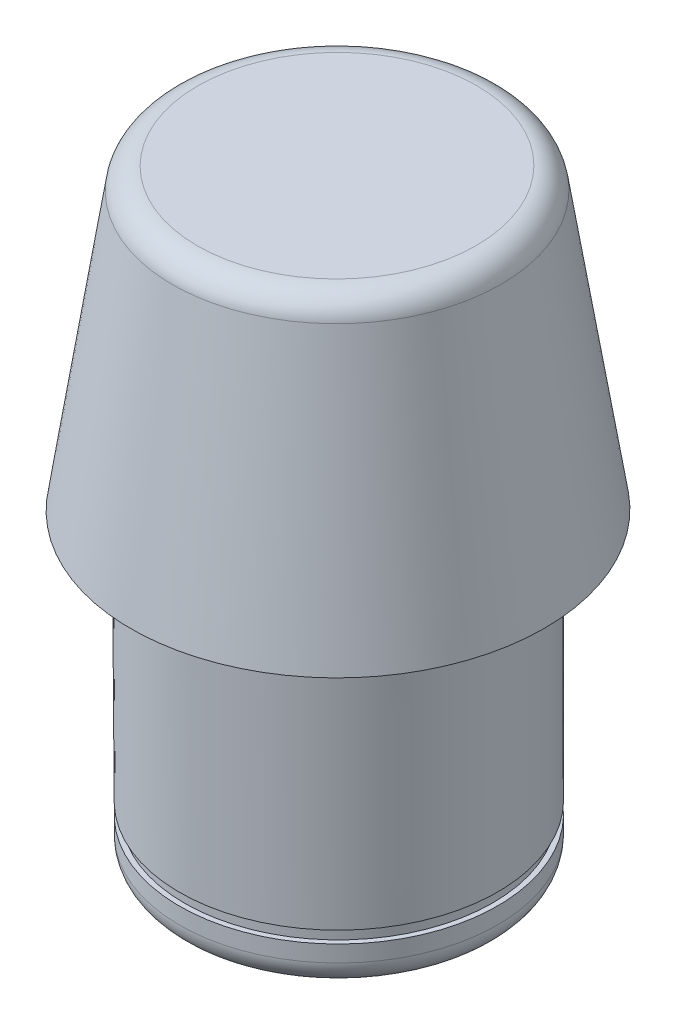
ISO-10303-21;
HEADER;
FILE_DESCRIPTION(('STEP AP214'),'2;1');
FILE_NAME('part.step','',(''),(''),'','','');
FILE_SCHEMA(('AUTOMOTIVE_DESIGN { 1 0 10303 214 1 1 1 1 }'));
ENDSEC;
DATA;
#1=APPLICATION_CONTEXT('core data for automotive mechanical design processes');
#2=APPLICATION_PROTOCOL_DEFINITION('international standard','automotive_design',2000,#1);
#3=PRODUCT_CONTEXT('',#1,'mechanical');
#4=PRODUCT('Part','Part','',(#3));
#5=PRODUCT_RELATED_PRODUCT_CATEGORY('part','',(#4));
#6=PRODUCT_DEFINITION_FORMATION('','',#4);
#7=PRODUCT_DEFINITION_CONTEXT('part definition',#1,'design');
#8=PRODUCT_DEFINITION('design','',#6,#7);
#9=PRODUCT_DEFINITION_SHAPE('','',#8);
#10=(LENGTH_UNIT() NAMED_UNIT(*) SI_UNIT(.MILLI.,.METRE.));
#11=(NAMED_UNIT(*) PLANE_ANGLE_UNIT() SI_UNIT($,.RADIAN.));
#12=(NAMED_UNIT(*) SI_UNIT($,.STERADIAN.) SOLID_ANGLE_UNIT());
#13=UNCERTAINTY_MEASURE_WITH_UNIT(LENGTH_MEASURE(1.E-05),#10,'distance_accuracy_value','');
#14=(GEOMETRIC_REPRESENTATION_CONTEXT(3) GLOBAL_UNCERTAINTY_ASSIGNED_CONTEXT((#13)) GLOBAL_UNIT_ASSIGNED_CONTEXT((#10,
#11,#12)) REPRESENTATION_CONTEXT('',''));
#15=CARTESIAN_POINT('',(0.,0.,0.));
#16=DIRECTION('',(0.,0.,1.));
#17=DIRECTION('',(1.,0.,0.));
#18=AXIS2_PLACEMENT_3D('',#15,#16,#17);
#19=CARTESIAN_POINT('',(-0.101521758380697,30.456527514209,0.));
#20=DIRECTION('',(0.00333331481496914,-0.99999444449074,0.));
#21=DIRECTION('',(0.99999444449074,0.00333331481496914,0.));
#22=AXIS2_PLACEMENT_3D('',#19,#20,#21);
#23=CONICAL_SURFACE('',#22,7.04178485798843,1.56746300580716);
#24=CARTESIAN_POINT('',(-0.1016,30.48,0.));
#25=VERTEX_POINT('',#24);
#26=VERTEX_LOOP('',#25);
#27=FACE_BOUND('',#26,.T.);
#28=CARTESIAN_POINT('',(-0.101521758380697,30.456527514209,0.));
#29=DIRECTION('',(-0.00333331481496914,0.99999444449074,0.));
#30=DIRECTION('',(-0.99999444449074,-0.00333331481496914,0.));
#31=AXIS2_PLACEMENT_3D('',#28,#29,#30);
#32=CIRCLE('',#31,7.04178485798843);
#33=CARTESIAN_POINT('',(-7.14326749566815,30.4330550284181,0.));
#34=VERTEX_POINT('',#33);
#35=EDGE_CURVE('E11',#34,#34,#32,.T.);
#36=ORIENTED_EDGE('',*,*,#35,.T.);
#37=EDGE_LOOP('',(#36));
#38=FACE_BOUND('',#37,.T.);
#39=ADVANCED_FACE('F33',(#27,#38),#23,.T.);
#40=CARTESIAN_POINT('',(-0.0972884720838781,29.1865416251634,0.));
#41=DIRECTION('',(-0.00333331481496914,0.99999444449074,0.));
#42=DIRECTION('',(-0.99999444449074,-0.00333331481496914,0.));
#43=AXIS2_PLACEMENT_3D('',#40,#41,#42);
#44=TOROIDAL_SURFACE('',#43,7.03755154817343,1.27);
#45=ORIENTED_EDGE('',*,*,#35,.F.);
#46=EDGE_LOOP('',(#45));
#47=FACE_BOUND('',#46,.T.);
#48=CARTESIAN_POINT('',(-0.0979310800741262,29.3793240222378,0.));
#49=DIRECTION('',(-0.00333331481496914,0.99999444449074,0.));
#50=DIRECTION('',(-0.99999444449074,-0.00333331481496914,0.));
#51=AXIS2_PLACEMENT_3D('',#48,#49,#50);
#52=CIRCLE('',#51,8.29283419938519);
#53=CARTESIAN_POINT('',(-8.39071920854213,29.3516813951429,0.));
#54=VERTEX_POINT('',#53);
#55=EDGE_CURVE('E40',#54,#54,#52,.T.);
#56=ORIENTED_EDGE('',*,*,#55,.T.);
#57=EDGE_LOOP('',(#56));
#58=FACE_BOUND('',#57,.T.);
#59=ADVANCED_FACE('F59',(#47,#58),#44,.T.);
#60=CARTESIAN_POINT('',(-0.051347173782191,15.4041521346573,0.));
#61=DIRECTION('',(0.00333331481496914,-0.99999444449074,0.));
#62=DIRECTION('',(0.99999444449074,0.00333331481496914,0.));
#63=AXIS2_PLACEMENT_3D('',#60,#61,#62);
#64=CONICAL_SURFACE('',#63,10.439121387059,0.152387106536995);
#65=ORIENTED_EDGE('',*,*,#55,.F.);
#66=EDGE_LOOP('',(#65));
#67=FACE_BOUND('',#66,.T.);
#68=CARTESIAN_POINT('',(-0.051347173782191,15.4041521346573,0.));
#69=DIRECTION('',(-0.00333331481496914,0.99999444449074,0.));
#70=DIRECTION('',(-0.99999444449074,-0.00333331481496914,0.));
#71=AXIS2_PLACEMENT_3D('',#68,#69,#70);
#72=CIRCLE('',#71,10.439121387059);
#73=CARTESIAN_POINT('',(-10.4904105662057,15.3693552566825,0.));
#74=VERTEX_POINT('',#73);
#75=EDGE_CURVE('E71',#74,#74,#72,.T.);
#76=ORIENTED_EDGE('',*,*,#75,.T.);
#77=EDGE_LOOP('',(#76));
#78=FACE_BOUND('',#77,.T.);
#79=ADVANCED_FACE('F63',(#67,#78),#64,.T.);
#80=CARTESIAN_POINT('',(-0.0464769680336887,13.9430904101066,0.));
#81=DIRECTION('',(-0.00333331481496914,0.99999444449074,0.));
#82=DIRECTION('',(-0.99999444449074,-0.00333331481496914,0.));
#83=AXIS2_PLACEMENT_3D('',#80,#81,#82);
#84=CONICAL_SURFACE('',#83,8.0729218172256,1.0176263238864);
#85=ORIENTED_EDGE('',*,*,#75,.F.);
#86=EDGE_LOOP('',(#85));
#87=FACE_BOUND('',#86,.T.);
#88=CARTESIAN_POINT('',(-0.0464769680336887,13.9430904101066,0.));
#89=DIRECTION('',(-0.00333331481496914,0.99999444449074,0.));
#90=DIRECTION('',(-0.99999444449074,-0.00333331481496914,0.));
#91=AXIS2_PLACEMENT_3D('',#88,#89,#90);
#92=CIRCLE('',#91,8.0729218172256);
#93=CARTESIAN_POINT('',(-8.11935393606738,13.9161808202131,0.));
#94=VERTEX_POINT('',#93);
#95=EDGE_CURVE('E73',#94,#94,#92,.T.);
#96=ORIENTED_EDGE('',*,*,#95,.T.);
#97=EDGE_LOOP('',(#96));
#98=FACE_BOUND('',#97,.T.);
#99=ADVANCED_FACE('F120',(#87,#98),#84,.T.);
#100=CARTESIAN_POINT('',(-0.00894338648735506,2.68301594620651,0.));
#101=DIRECTION('',(-0.00333331481496914,0.99999444449074,0.));
#102=DIRECTION('',(-0.99999444449074,-0.00333331481496914,0.));
#103=AXIS2_PLACEMENT_3D('',#100,#101,#102);
#104=CONICAL_SURFACE('',#103,8.03538802715994,0.00333332098773657);
#105=ORIENTED_EDGE('',*,*,#95,.F.);
#106=EDGE_LOOP('',(#105));
#107=FACE_BOUND('',#106,.T.);
#108=CARTESIAN_POINT('',(-0.00894338648735506,2.68301594620651,0.));
#109=DIRECTION('',(-0.00333331481496914,0.99999444449074,0.));
#110=DIRECTION('',(-0.99999444449074,-0.00333331481496914,0.));
#111=AXIS2_PLACEMENT_3D('',#108,#109,#110);
#112=CIRCLE('',#111,8.03538802715995);
#113=CARTESIAN_POINT('',(-8.04428677297471,2.65623146825155,0.));
#114=VERTEX_POINT('',#113);
#115=EDGE_CURVE('E78',#114,#114,#112,.T.);
#116=ORIENTED_EDGE('',*,*,#115,.T.);
#117=EDGE_LOOP('',(#116));
#118=FACE_BOUND('',#117,.T.);
#119=ADVANCED_FACE('F116',(#107,#118),#104,.T.);
#120=CARTESIAN_POINT('',(-0.00894620867821961,2.68386260346587,0.));
#121=DIRECTION('',(0.00333331481496914,-0.99999444449074,0.));
#122=DIRECTION('',(0.99999444449074,0.00333331481496914,0.));
#123=AXIS2_PLACEMENT_3D('',#120,#121,#122);
#124=CONICAL_SURFACE('',#123,7.7813894382593,1.56746300580715);
#125=ORIENTED_EDGE('',*,*,#115,.F.);
#126=EDGE_LOOP('',(#125));
#127=FACE_BOUND('',#126,.T.);
#128=CARTESIAN_POINT('',(-0.00894620867821961,2.68386260346587,0.));
#129=DIRECTION('',(-0.00333331481496914,0.99999444449074,0.));
#130=DIRECTION('',(-0.99999444449074,-0.00333331481496914,0.));
#131=AXIS2_PLACEMENT_3D('',#128,#129,#130);
#132=CIRCLE('',#131,7.7813894382593);
#133=CARTESIAN_POINT('',(-7.79029241735644,2.65792478277028,0.));
#134=VERTEX_POINT('',#133);
#135=EDGE_CURVE('E81',#134,#134,#132,.T.);
#136=ORIENTED_EDGE('',*,*,#135,.T.);
#137=EDGE_LOOP('',(#136));
#138=FACE_BOUND('',#137,.T.);
#139=ADVANCED_FACE('F112',(#127,#138),#124,.F.);
#140=CARTESIAN_POINT('',(-0.00692312062294759,2.07693618688427,0.));
#141=DIRECTION('',(-0.00333331481496914,0.99999444449074,0.));
#142=DIRECTION('',(-0.99999444449074,-0.00333331481496914,0.));
#143=AXIS2_PLACEMENT_3D('',#140,#141,#142);
#144=CONICAL_SURFACE('',#143,7.77936633896468,0.00333332098773799);
#145=ORIENTED_EDGE('',*,*,#135,.F.);
#146=EDGE_LOOP('',(#145));
#147=FACE_BOUND('',#146,.T.);
#148=CARTESIAN_POINT('',(-0.00692312062294759,2.07693618688427,0.));
#149=DIRECTION('',(-0.00333331481496914,0.99999444449074,0.));
#150=DIRECTION('',(-0.99999444449074,-0.00333331481496914,0.));
#151=AXIS2_PLACEMENT_3D('',#148,#149,#150);
#152=CIRCLE('',#151,7.77936633896468);
#153=CARTESIAN_POINT('',(-7.7862462412459,2.05100510981553,0.));
#154=VERTEX_POINT('',#153);
#155=EDGE_CURVE('E84',#154,#154,#152,.T.);
#156=ORIENTED_EDGE('',*,*,#155,.T.);
#157=EDGE_LOOP('',(#156));
#158=FACE_BOUND('',#157,.T.);
#159=ADVANCED_FACE('F105',(#147,#158),#144,.T.);
#160=CARTESIAN_POINT('',(-0.00692029843208304,2.0760895296249,0.));
#161=DIRECTION('',(0.00333331481496914,-0.99999444449074,0.));
#162=DIRECTION('',(0.99999444449074,0.00333331481496914,0.));
#163=AXIS2_PLACEMENT_3D('',#160,#161,#162);
#164=CONICAL_SURFACE('',#163,8.03336492786533,1.56746300580715);
#165=ORIENTED_EDGE('',*,*,#155,.F.);
#166=EDGE_LOOP('',(#165));
#167=FACE_BOUND('',#166,.T.);
#168=CARTESIAN_POINT('',(-0.00692029843208304,2.0760895296249,0.));
#169=DIRECTION('',(-0.00333331481496914,0.99999444449074,0.));
#170=DIRECTION('',(-0.99999444449074,-0.00333331481496914,0.));
#171=AXIS2_PLACEMENT_3D('',#168,#169,#170);
#172=CIRCLE('',#171,8.03336492786533);
#173=CARTESIAN_POINT('',(-8.04024059686417,2.0493117952968,0.));
#174=VERTEX_POINT('',#173);
#175=EDGE_CURVE('E87',#174,#174,#172,.T.);
#176=ORIENTED_EDGE('',*,*,#175,.T.);
#177=EDGE_LOOP('',(#176));
#178=FACE_BOUND('',#177,.T.);
#179=ADVANCED_FACE('F99',(#167,#178),#164,.T.);
#180=CARTESIAN_POINT('',(-0.00414410506549928,1.24323151964978,0.));
#181=DIRECTION('',(-0.00333331481496914,0.99999444449074,0.));
#182=DIRECTION('',(-0.99999444449074,-0.00333331481496914,0.));
#183=AXIS2_PLACEMENT_3D('',#180,#181,#182);
#184=CONICAL_SURFACE('',#183,8.03058871907549,0.00333332098773863);
#185=ORIENTED_EDGE('',*,*,#175,.F.);
#186=EDGE_LOOP('',(#185));
#187=FACE_BOUND('',#186,.T.);
#188=CARTESIAN_POINT('',(-0.00414410506549928,1.24323151964978,0.));
#189=DIRECTION('',(-0.00333331481496914,0.99999444449074,0.));
#190=DIRECTION('',(-0.99999444449074,-0.00333331481496914,0.));
#191=AXIS2_PLACEMENT_3D('',#188,#189,#190);
#192=CIRCLE('',#191,8.03058871907549);
#193=CARTESIAN_POINT('',(-8.034688210131,1.21646303929956,0.));
#194=VERTEX_POINT('',#193);
#195=EDGE_CURVE('E90',#194,#194,#192,.T.);
#196=ORIENTED_EDGE('',*,*,#195,.T.);
#197=EDGE_LOOP('',(#196));
#198=FACE_BOUND('',#197,.T.);
#199=ADVANCED_FACE('F54',(#187,#198),#184,.T.);
#200=CARTESIAN_POINT('',(-0.00415821601982159,1.24746480594659,0.));
#201=DIRECTION('',(-0.00333331481496914,0.99999444449074,0.));
#202=DIRECTION('',(-0.99999444449074,-0.00333331481496914,0.));
#203=AXIS2_PLACEMENT_3D('',#200,#201,#202);
#204=TOROIDAL_SURFACE('',#203,6.76059577457225,1.27);
#205=ORIENTED_EDGE('',*,*,#195,.F.);
#206=EDGE_LOOP('',(#205));
#207=FACE_BOUND('',#206,.T.);
#208=CARTESIAN_POINT('',(7.50702769969515E-05,-0.0225210830990842,0.));
#209=DIRECTION('',(-0.00333331481496914,0.99999444449074,0.));
#210=DIRECTION('',(-0.99999444449074,-0.00333331481496914,0.));
#211=AXIS2_PLACEMENT_3D('',#208,#209,#210);
#212=CIRCLE('',#211,6.75636246475723);
#213=CARTESIAN_POINT('',(-6.756249859446,-0.0450421661981609,0.));
#214=VERTEX_POINT('',#213);
#215=EDGE_CURVE('E93',#214,#214,#212,.T.);
#216=ORIENTED_EDGE('',*,*,#215,.T.);
#217=EDGE_LOOP('',(#216));
#218=FACE_BOUND('',#217,.T.);
#219=ADVANCED_FACE('F48',(#207,#218),#204,.T.);
#220=CARTESIAN_POINT('',(0.,0.,0.));
#221=DIRECTION('',(0.00333331481496914,-0.99999444449074,0.));
#222=DIRECTION('',(0.99999444449074,0.00333331481496914,0.));
#223=AXIS2_PLACEMENT_3D('',#220,#221,#222);
#224=CONICAL_SURFACE('',#223,0.,1.56746300580716);
#225=ORIENTED_EDGE('',*,*,#215,.F.);
#226=EDGE_LOOP('',(#225));
#227=FACE_BOUND('',#226,.T.);
#228=CARTESIAN_POINT('',(0.,0.,0.));
#229=VERTEX_POINT('',#228);
#230=VERTEX_LOOP('',#229);
#231=FACE_BOUND('',#230,.T.);
#232=ADVANCED_FACE('F46',(#227,#231),#224,.F.);
#233=CLOSED_SHELL('',(#39,#59,#79,#99,#119,#139,#159,#179,#199,#219,#232));
#234=MANIFOLD_SOLID_BREP('B2',#233);
#235=ADVANCED_BREP_SHAPE_REPRESENTATION('',(#18,#234),#14);
#236=SHAPE_DEFINITION_REPRESENTATION(#9,#235);
ENDSEC;
END-ISO-10303-21;
